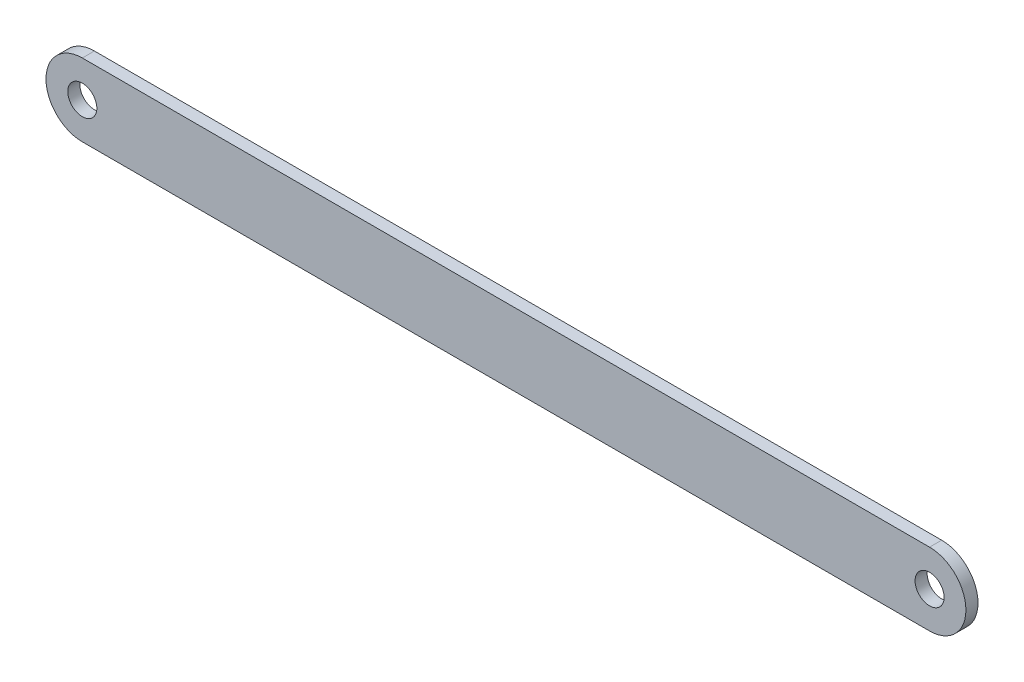
ISO-10303-21;
HEADER;
FILE_DESCRIPTION(('STEP AP214'),'2;1');
FILE_NAME('part.step','',(''),(''),'','','');
FILE_SCHEMA(('AUTOMOTIVE_DESIGN { 1 0 10303 214 1 1 1 1 }'));
ENDSEC;
DATA;
#1=APPLICATION_CONTEXT('core data for automotive mechanical design processes');
#2=APPLICATION_PROTOCOL_DEFINITION('international standard','automotive_design',2000,#1);
#3=PRODUCT_CONTEXT('',#1,'mechanical');
#4=PRODUCT('Part','Part','',(#3));
#5=PRODUCT_RELATED_PRODUCT_CATEGORY('part','',(#4));
#6=PRODUCT_DEFINITION_FORMATION('','',#4);
#7=PRODUCT_DEFINITION_CONTEXT('part definition',#1,'design');
#8=PRODUCT_DEFINITION('design','',#6,#7);
#9=PRODUCT_DEFINITION_SHAPE('','',#8);
#10=(LENGTH_UNIT() NAMED_UNIT(*) SI_UNIT(.MILLI.,.METRE.));
#11=(NAMED_UNIT(*) PLANE_ANGLE_UNIT() SI_UNIT($,.RADIAN.));
#12=(NAMED_UNIT(*) SI_UNIT($,.STERADIAN.) SOLID_ANGLE_UNIT());
#13=UNCERTAINTY_MEASURE_WITH_UNIT(LENGTH_MEASURE(1.E-05),#10,'distance_accuracy_value','');
#14=(GEOMETRIC_REPRESENTATION_CONTEXT(3) GLOBAL_UNCERTAINTY_ASSIGNED_CONTEXT((#13)) GLOBAL_UNIT_ASSIGNED_CONTEXT((#10,
#11,#12)) REPRESENTATION_CONTEXT('',''));
#15=CARTESIAN_POINT('',(0.,0.,0.));
#16=DIRECTION('',(0.,0.,1.));
#17=DIRECTION('',(1.,0.,0.));
#18=AXIS2_PLACEMENT_3D('',#15,#16,#17);
#19=CARTESIAN_POINT('',(0.,0.,5.));
#20=DIRECTION('',(0.,0.,1.));
#21=DIRECTION('',(1.,0.,0.));
#22=AXIS2_PLACEMENT_3D('',#19,#20,#21);
#23=PLANE('',#22);
#24=CARTESIAN_POINT('',(0.,0.,5.));
#25=DIRECTION('',(0.,0.,1.));
#26=DIRECTION('',(1.,0.,0.));
#27=AXIS2_PLACEMENT_3D('',#24,#25,#26);
#28=CIRCLE('',#27,6.);
#29=CARTESIAN_POINT('',(6.,0.,5.));
#30=VERTEX_POINT('',#29);
#31=EDGE_CURVE('E102',#30,#30,#28,.T.);
#32=ORIENTED_EDGE('',*,*,#31,.F.);
#33=EDGE_LOOP('',(#32));
#34=FACE_BOUND('',#33,.T.);
#35=CARTESIAN_POINT('',(0.,0.,5.));
#36=DIRECTION('',(0.,0.,1.));
#37=DIRECTION('',(1.,0.,0.));
#38=AXIS2_PLACEMENT_3D('',#35,#36,#37);
#39=CIRCLE('',#38,15.);
#40=CARTESIAN_POINT('',(0.,15.,5.));
#41=VERTEX_POINT('',#40);
#42=CARTESIAN_POINT('',(0.,-15.,5.));
#43=VERTEX_POINT('',#42);
#44=EDGE_CURVE('E86',#41,#43,#39,.T.);
#45=ORIENTED_EDGE('',*,*,#44,.T.);
#46=DIRECTION('',(1.,0.,0.));
#47=VECTOR('',#46,1.);
#48=CARTESIAN_POINT('',(0.,-15.,5.));
#49=LINE('',#48,#47);
#50=CARTESIAN_POINT('',(350.,-15.,5.));
#51=VERTEX_POINT('',#50);
#52=EDGE_CURVE('E81',#43,#51,#49,.T.);
#53=ORIENTED_EDGE('',*,*,#52,.T.);
#54=CARTESIAN_POINT('',(350.,0.,5.));
#55=DIRECTION('',(0.,0.,1.));
#56=DIRECTION('',(1.,0.,0.));
#57=AXIS2_PLACEMENT_3D('',#54,#55,#56);
#58=CIRCLE('',#57,15.);
#59=CARTESIAN_POINT('',(350.,15.,5.));
#60=VERTEX_POINT('',#59);
#61=EDGE_CURVE('E84',#51,#60,#58,.T.);
#62=ORIENTED_EDGE('',*,*,#61,.T.);
#63=DIRECTION('',(-1.,0.,0.));
#64=VECTOR('',#63,1.);
#65=CARTESIAN_POINT('',(0.,15.,5.));
#66=LINE('',#65,#64);
#67=EDGE_CURVE('E51',#60,#41,#66,.T.);
#68=ORIENTED_EDGE('',*,*,#67,.T.);
#69=EDGE_LOOP('',(#45,#53,#62,#68));
#70=FACE_BOUND('',#69,.T.);
#71=CARTESIAN_POINT('',(350.,0.,5.));
#72=DIRECTION('',(0.,0.,1.));
#73=DIRECTION('',(1.,0.,0.));
#74=AXIS2_PLACEMENT_3D('',#71,#72,#73);
#75=CIRCLE('',#74,5.99999999999999);
#76=CARTESIAN_POINT('',(356.,0.,5.));
#77=VERTEX_POINT('',#76);
#78=EDGE_CURVE('E118',#77,#77,#75,.T.);
#79=ORIENTED_EDGE('',*,*,#78,.F.);
#80=EDGE_LOOP('',(#79));
#81=FACE_BOUND('',#80,.T.);
#82=ADVANCED_FACE('F34',(#34,#70,#81),#23,.T.);
#83=CARTESIAN_POINT('',(0.,0.,0.));
#84=DIRECTION('',(0.,0.,1.));
#85=DIRECTION('',(1.,0.,0.));
#86=AXIS2_PLACEMENT_3D('',#83,#84,#85);
#87=PLANE('',#86);
#88=CARTESIAN_POINT('',(0.,0.,0.));
#89=DIRECTION('',(0.,0.,1.));
#90=DIRECTION('',(1.,0.,0.));
#91=AXIS2_PLACEMENT_3D('',#88,#89,#90);
#92=CIRCLE('',#91,6.);
#93=CARTESIAN_POINT('',(6.,0.,0.));
#94=VERTEX_POINT('',#93);
#95=EDGE_CURVE('E115',#94,#94,#92,.T.);
#96=ORIENTED_EDGE('',*,*,#95,.T.);
#97=EDGE_LOOP('',(#96));
#98=FACE_BOUND('',#97,.T.);
#99=CARTESIAN_POINT('',(0.,0.,0.));
#100=DIRECTION('',(0.,0.,1.));
#101=DIRECTION('',(1.,0.,0.));
#102=AXIS2_PLACEMENT_3D('',#99,#100,#101);
#103=CIRCLE('',#102,15.);
#104=CARTESIAN_POINT('',(0.,15.,0.));
#105=VERTEX_POINT('',#104);
#106=CARTESIAN_POINT('',(0.,-15.,0.));
#107=VERTEX_POINT('',#106);
#108=EDGE_CURVE('E99',#105,#107,#103,.T.);
#109=ORIENTED_EDGE('',*,*,#108,.F.);
#110=DIRECTION('',(-1.,0.,0.));
#111=VECTOR('',#110,1.);
#112=CARTESIAN_POINT('',(0.,15.,0.));
#113=LINE('',#112,#111);
#114=CARTESIAN_POINT('',(350.,15.,0.));
#115=VERTEX_POINT('',#114);
#116=EDGE_CURVE('E74',#115,#105,#113,.T.);
#117=ORIENTED_EDGE('',*,*,#116,.F.);
#118=CARTESIAN_POINT('',(350.,0.,0.));
#119=DIRECTION('',(0.,0.,1.));
#120=DIRECTION('',(1.,0.,0.));
#121=AXIS2_PLACEMENT_3D('',#118,#119,#120);
#122=CIRCLE('',#121,15.);
#123=CARTESIAN_POINT('',(350.,-15.,0.));
#124=VERTEX_POINT('',#123);
#125=EDGE_CURVE('E68',#124,#115,#122,.T.);
#126=ORIENTED_EDGE('',*,*,#125,.F.);
#127=DIRECTION('',(1.,0.,0.));
#128=VECTOR('',#127,1.);
#129=CARTESIAN_POINT('',(0.,-15.,0.));
#130=LINE('',#129,#128);
#131=EDGE_CURVE('E91',#107,#124,#130,.T.);
#132=ORIENTED_EDGE('',*,*,#131,.F.);
#133=EDGE_LOOP('',(#109,#117,#126,#132));
#134=FACE_BOUND('',#133,.T.);
#135=CARTESIAN_POINT('',(350.,0.,0.));
#136=DIRECTION('',(0.,0.,1.));
#137=DIRECTION('',(1.,0.,0.));
#138=AXIS2_PLACEMENT_3D('',#135,#136,#137);
#139=CIRCLE('',#138,5.99999999999999);
#140=CARTESIAN_POINT('',(356.,0.,0.));
#141=VERTEX_POINT('',#140);
#142=EDGE_CURVE('E121',#141,#141,#139,.T.);
#143=ORIENTED_EDGE('',*,*,#142,.T.);
#144=EDGE_LOOP('',(#143));
#145=FACE_BOUND('',#144,.T.);
#146=ADVANCED_FACE('F111',(#98,#134,#145),#87,.F.);
#147=CARTESIAN_POINT('',(0.,0.,5.));
#148=DIRECTION('',(0.,0.,-1.));
#149=DIRECTION('',(-1.,0.,0.));
#150=AXIS2_PLACEMENT_3D('',#147,#148,#149);
#151=CYLINDRICAL_SURFACE('',#150,15.);
#152=ORIENTED_EDGE('',*,*,#108,.T.);
#153=DIRECTION('',(0.,0.,-1.));
#154=VECTOR('',#153,1.);
#155=CARTESIAN_POINT('',(0.,-15.,5.));
#156=LINE('',#155,#154);
#157=EDGE_CURVE('E11',#43,#107,#156,.T.);
#158=ORIENTED_EDGE('',*,*,#157,.F.);
#159=ORIENTED_EDGE('',*,*,#44,.F.);
#160=DIRECTION('',(0.,0.,-1.));
#161=VECTOR('',#160,1.);
#162=CARTESIAN_POINT('',(0.,15.,5.));
#163=LINE('',#162,#161);
#164=EDGE_CURVE('E95',#41,#105,#163,.T.);
#165=ORIENTED_EDGE('',*,*,#164,.T.);
#166=EDGE_LOOP('',(#152,#158,#159,#165));
#167=FACE_BOUND('',#166,.T.);
#168=ADVANCED_FACE('F36',(#167),#151,.T.);
#169=CARTESIAN_POINT('',(0.,-15.,5.));
#170=DIRECTION('',(0.,1.,0.));
#171=DIRECTION('',(0.,0.,1.));
#172=AXIS2_PLACEMENT_3D('',#169,#170,#171);
#173=PLANE('',#172);
#174=ORIENTED_EDGE('',*,*,#131,.T.);
#175=DIRECTION('',(0.,0.,-1.));
#176=VECTOR('',#175,1.);
#177=CARTESIAN_POINT('',(350.,-15.,5.));
#178=LINE('',#177,#176);
#179=EDGE_CURVE('E43',#51,#124,#178,.T.);
#180=ORIENTED_EDGE('',*,*,#179,.F.);
#181=ORIENTED_EDGE('',*,*,#52,.F.);
#182=ORIENTED_EDGE('',*,*,#157,.T.);
#183=EDGE_LOOP('',(#174,#180,#181,#182));
#184=FACE_BOUND('',#183,.T.);
#185=ADVANCED_FACE('F90',(#184),#173,.F.);
#186=CARTESIAN_POINT('',(350.,0.,5.));
#187=DIRECTION('',(0.,0.,-1.));
#188=DIRECTION('',(-1.,0.,0.));
#189=AXIS2_PLACEMENT_3D('',#186,#187,#188);
#190=CYLINDRICAL_SURFACE('',#189,15.);
#191=ORIENTED_EDGE('',*,*,#125,.T.);
#192=DIRECTION('',(0.,0.,-1.));
#193=VECTOR('',#192,1.);
#194=CARTESIAN_POINT('',(350.,15.,5.));
#195=LINE('',#194,#193);
#196=EDGE_CURVE('E92',#60,#115,#195,.T.);
#197=ORIENTED_EDGE('',*,*,#196,.F.);
#198=ORIENTED_EDGE('',*,*,#61,.F.);
#199=ORIENTED_EDGE('',*,*,#179,.T.);
#200=EDGE_LOOP('',(#191,#197,#198,#199));
#201=FACE_BOUND('',#200,.T.);
#202=ADVANCED_FACE('F93',(#201),#190,.T.);
#203=CARTESIAN_POINT('',(0.,15.,5.));
#204=DIRECTION('',(0.,-1.,0.));
#205=DIRECTION('',(0.,0.,-1.));
#206=AXIS2_PLACEMENT_3D('',#203,#204,#205);
#207=PLANE('',#206);
#208=ORIENTED_EDGE('',*,*,#116,.T.);
#209=ORIENTED_EDGE('',*,*,#164,.F.);
#210=ORIENTED_EDGE('',*,*,#67,.F.);
#211=ORIENTED_EDGE('',*,*,#196,.T.);
#212=EDGE_LOOP('',(#208,#209,#210,#211));
#213=FACE_BOUND('',#212,.T.);
#214=ADVANCED_FACE('F108',(#213),#207,.F.);
#215=CARTESIAN_POINT('',(0.,0.,5.));
#216=DIRECTION('',(0.,0.,-1.));
#217=DIRECTION('',(-1.,0.,0.));
#218=AXIS2_PLACEMENT_3D('',#215,#216,#217);
#219=CYLINDRICAL_SURFACE('',#218,6.);
#220=ORIENTED_EDGE('',*,*,#31,.T.);
#221=EDGE_LOOP('',(#220));
#222=FACE_BOUND('',#221,.T.);
#223=ORIENTED_EDGE('',*,*,#95,.F.);
#224=EDGE_LOOP('',(#223));
#225=FACE_BOUND('',#224,.T.);
#226=ADVANCED_FACE('F139',(#222,#225),#219,.F.);
#227=CARTESIAN_POINT('',(350.,0.,5.));
#228=DIRECTION('',(0.,0.,-1.));
#229=DIRECTION('',(-1.,0.,0.));
#230=AXIS2_PLACEMENT_3D('',#227,#228,#229);
#231=CYLINDRICAL_SURFACE('',#230,5.99999999999999);
#232=ORIENTED_EDGE('',*,*,#78,.T.);
#233=EDGE_LOOP('',(#232));
#234=FACE_BOUND('',#233,.T.);
#235=ORIENTED_EDGE('',*,*,#142,.F.);
#236=EDGE_LOOP('',(#235));
#237=FACE_BOUND('',#236,.T.);
#238=ADVANCED_FACE('F127',(#234,#237),#231,.F.);
#239=CLOSED_SHELL('',(#82,#146,#168,#185,#202,#214,#226,#238));
#240=MANIFOLD_SOLID_BREP('B2',#239);
#241=ADVANCED_BREP_SHAPE_REPRESENTATION('',(#18,#240),#14);
#242=SHAPE_DEFINITION_REPRESENTATION(#9,#241);
ENDSEC;
END-ISO-10303-21;
